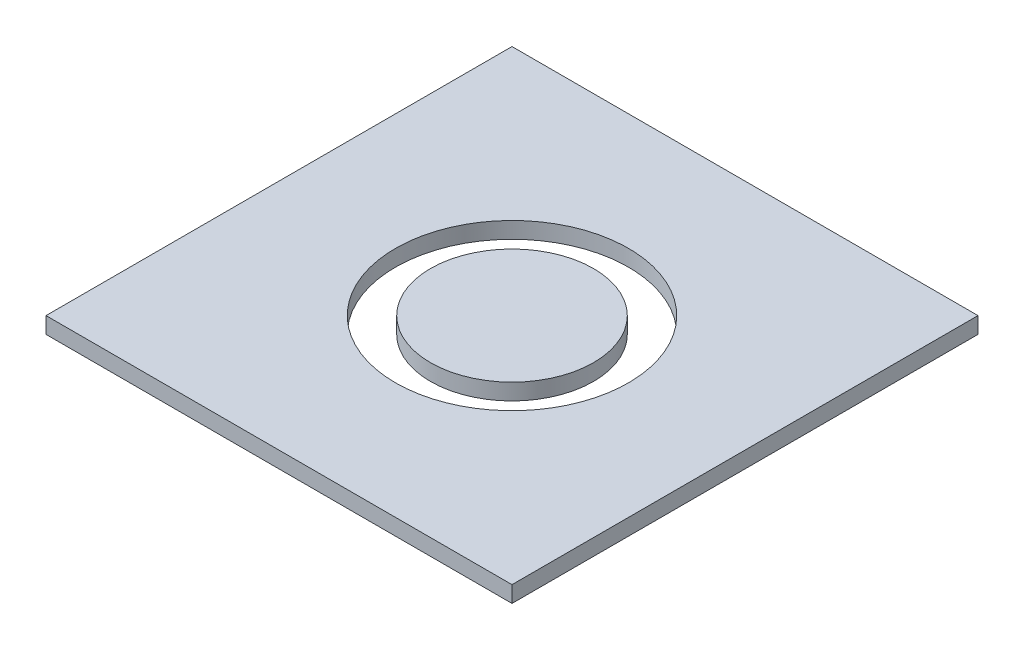
ISO-10303-21;
HEADER;
FILE_DESCRIPTION(('STEP AP214'),'2;1');
FILE_NAME('part.step','',(''),(''),'','','');
FILE_SCHEMA(('AUTOMOTIVE_DESIGN { 1 0 10303 214 1 1 1 1 }'));
ENDSEC;
DATA;
#1=APPLICATION_CONTEXT('core data for automotive mechanical design processes');
#2=APPLICATION_PROTOCOL_DEFINITION('international standard','automotive_design',2000,#1);
#3=PRODUCT_CONTEXT('',#1,'mechanical');
#4=PRODUCT('Part','Part','',(#3));
#5=PRODUCT_RELATED_PRODUCT_CATEGORY('part','',(#4));
#6=PRODUCT_DEFINITION_FORMATION('','',#4);
#7=PRODUCT_DEFINITION_CONTEXT('part definition',#1,'design');
#8=PRODUCT_DEFINITION('design','',#6,#7);
#9=PRODUCT_DEFINITION_SHAPE('','',#8);
#10=(LENGTH_UNIT() NAMED_UNIT(*) SI_UNIT(.MILLI.,.METRE.));
#11=(NAMED_UNIT(*) PLANE_ANGLE_UNIT() SI_UNIT($,.RADIAN.));
#12=(NAMED_UNIT(*) SI_UNIT($,.STERADIAN.) SOLID_ANGLE_UNIT());
#13=UNCERTAINTY_MEASURE_WITH_UNIT(LENGTH_MEASURE(1.E-05),#10,'distance_accuracy_value','');
#14=(GEOMETRIC_REPRESENTATION_CONTEXT(3) GLOBAL_UNCERTAINTY_ASSIGNED_CONTEXT((#13)) GLOBAL_UNIT_ASSIGNED_CONTEXT((#10,
#11,#12)) REPRESENTATION_CONTEXT('',''));
#15=CARTESIAN_POINT('',(0.,0.,0.));
#16=DIRECTION('',(0.,0.,1.));
#17=DIRECTION('',(1.,0.,0.));
#18=AXIS2_PLACEMENT_3D('',#15,#16,#17);
#19=CARTESIAN_POINT('',(0.,0.7,0.));
#20=DIRECTION('',(0.,-1.,0.));
#21=DIRECTION('',(0.,0.,-1.));
#22=AXIS2_PLACEMENT_3D('',#19,#20,#21);
#23=CYLINDRICAL_SURFACE('',#22,3.5);
#24=CARTESIAN_POINT('',(0.,0.7,0.));
#25=DIRECTION('',(0.,1.,0.));
#26=DIRECTION('',(0.,0.,1.));
#27=AXIS2_PLACEMENT_3D('',#24,#25,#26);
#28=CIRCLE('',#27,3.5);
#29=CARTESIAN_POINT('',(0.,0.7,3.5));
#30=VERTEX_POINT('',#29);
#31=EDGE_CURVE('E11',#30,#30,#28,.T.);
#32=ORIENTED_EDGE('',*,*,#31,.F.);
#33=EDGE_LOOP('',(#32));
#34=FACE_BOUND('',#33,.T.);
#35=CARTESIAN_POINT('',(0.,0.,0.));
#36=DIRECTION('',(0.,1.,0.));
#37=DIRECTION('',(0.,0.,1.));
#38=AXIS2_PLACEMENT_3D('',#35,#36,#37);
#39=CIRCLE('',#38,3.5);
#40=CARTESIAN_POINT('',(0.,0.,3.5));
#41=VERTEX_POINT('',#40);
#42=EDGE_CURVE('E44',#41,#41,#39,.T.);
#43=ORIENTED_EDGE('',*,*,#42,.T.);
#44=EDGE_LOOP('',(#43));
#45=FACE_BOUND('',#44,.T.);
#46=ADVANCED_FACE('F41',(#34,#45),#23,.T.);
#47=CARTESIAN_POINT('',(0.,0.7,0.));
#48=DIRECTION('',(0.,1.,0.));
#49=DIRECTION('',(0.,0.,1.));
#50=AXIS2_PLACEMENT_3D('',#47,#48,#49);
#51=PLANE('',#50);
#52=ORIENTED_EDGE('',*,*,#31,.T.);
#53=EDGE_LOOP('',(#52));
#54=FACE_BOUND('',#53,.T.);
#55=ADVANCED_FACE('F56',(#54),#51,.T.);
#56=CARTESIAN_POINT('',(0.,0.,0.));
#57=DIRECTION('',(0.,1.,0.));
#58=DIRECTION('',(0.,0.,1.));
#59=AXIS2_PLACEMENT_3D('',#56,#57,#58);
#60=PLANE('',#59);
#61=ORIENTED_EDGE('',*,*,#42,.F.);
#62=EDGE_LOOP('',(#61));
#63=FACE_BOUND('',#62,.T.);
#64=ADVANCED_FACE('F54',(#63),#60,.F.);
#65=CLOSED_SHELL('',(#46,#55,#64));
#66=MANIFOLD_SOLID_BREP('B2',#65);
#67=CARTESIAN_POINT('',(-10.,0.7,-10.));
#68=DIRECTION('',(0.,0.,-1.));
#69=DIRECTION('',(-1.,0.,0.));
#70=AXIS2_PLACEMENT_3D('',#67,#68,#69);
#71=PLANE('',#70);
#72=DIRECTION('',(1.,0.,0.));
#73=VECTOR('',#72,1.);
#74=CARTESIAN_POINT('',(-10.,0.,-10.));
#75=LINE('',#74,#73);
#76=CARTESIAN_POINT('',(-10.,0.,-10.));
#77=VERTEX_POINT('',#76);
#78=CARTESIAN_POINT('',(10.,0.,-10.));
#79=VERTEX_POINT('',#78);
#80=EDGE_CURVE('E148',#77,#79,#75,.T.);
#81=ORIENTED_EDGE('',*,*,#80,.F.);
#82=DIRECTION('',(0.,-1.,0.));
#83=VECTOR('',#82,1.);
#84=CARTESIAN_POINT('',(-10.,0.7,-10.));
#85=LINE('',#84,#83);
#86=CARTESIAN_POINT('',(-10.,0.7,-10.));
#87=VERTEX_POINT('',#86);
#88=EDGE_CURVE('E39',#87,#77,#85,.T.);
#89=ORIENTED_EDGE('',*,*,#88,.F.);
#90=DIRECTION('',(1.,0.,0.));
#91=VECTOR('',#90,1.);
#92=CARTESIAN_POINT('',(-10.,0.7,-10.));
#93=LINE('',#92,#91);
#94=CARTESIAN_POINT('',(10.,0.7,-10.));
#95=VERTEX_POINT('',#94);
#96=EDGE_CURVE('E142',#87,#95,#93,.T.);
#97=ORIENTED_EDGE('',*,*,#96,.T.);
#98=DIRECTION('',(0.,-1.,0.));
#99=VECTOR('',#98,1.);
#100=CARTESIAN_POINT('',(10.,0.7,-10.));
#101=LINE('',#100,#99);
#102=EDGE_CURVE('E85',#95,#79,#101,.T.);
#103=ORIENTED_EDGE('',*,*,#102,.T.);
#104=EDGE_LOOP('',(#81,#89,#97,#103));
#105=FACE_BOUND('',#104,.T.);
#106=ADVANCED_FACE('F82',(#105),#71,.T.);
#107=CARTESIAN_POINT('',(-10.,0.7,-10.));
#108=DIRECTION('',(1.,0.,0.));
#109=DIRECTION('',(0.,0.,-1.));
#110=AXIS2_PLACEMENT_3D('',#107,#108,#109);
#111=PLANE('',#110);
#112=DIRECTION('',(0.,0.,1.));
#113=VECTOR('',#112,1.);
#114=CARTESIAN_POINT('',(-10.,0.,-10.));
#115=LINE('',#114,#113);
#116=CARTESIAN_POINT('',(-10.,0.,10.));
#117=VERTEX_POINT('',#116);
#118=EDGE_CURVE('E115',#77,#117,#115,.T.);
#119=ORIENTED_EDGE('',*,*,#118,.T.);
#120=DIRECTION('',(0.,-1.,0.));
#121=VECTOR('',#120,1.);
#122=CARTESIAN_POINT('',(-10.,0.7,10.));
#123=LINE('',#122,#121);
#124=CARTESIAN_POINT('',(-10.,0.7,10.));
#125=VERTEX_POINT('',#124);
#126=EDGE_CURVE('E91',#125,#117,#123,.T.);
#127=ORIENTED_EDGE('',*,*,#126,.F.);
#128=DIRECTION('',(0.,0.,1.));
#129=VECTOR('',#128,1.);
#130=CARTESIAN_POINT('',(-10.,0.7,-10.));
#131=LINE('',#130,#129);
#132=EDGE_CURVE('E132',#87,#125,#131,.T.);
#133=ORIENTED_EDGE('',*,*,#132,.F.);
#134=ORIENTED_EDGE('',*,*,#88,.T.);
#135=EDGE_LOOP('',(#119,#127,#133,#134));
#136=FACE_BOUND('',#135,.T.);
#137=ADVANCED_FACE('F159',(#136),#111,.F.);
#138=CARTESIAN_POINT('',(-10.,0.7,10.));
#139=DIRECTION('',(0.,0.,-1.));
#140=DIRECTION('',(-1.,0.,0.));
#141=AXIS2_PLACEMENT_3D('',#138,#139,#140);
#142=PLANE('',#141);
#143=DIRECTION('',(1.,0.,0.));
#144=VECTOR('',#143,1.);
#145=CARTESIAN_POINT('',(-10.,0.,10.));
#146=LINE('',#145,#144);
#147=CARTESIAN_POINT('',(10.,0.,10.));
#148=VERTEX_POINT('',#147);
#149=EDGE_CURVE('E139',#117,#148,#146,.T.);
#150=ORIENTED_EDGE('',*,*,#149,.T.);
#151=DIRECTION('',(0.,-1.,0.));
#152=VECTOR('',#151,1.);
#153=CARTESIAN_POINT('',(10.,0.7,10.));
#154=LINE('',#153,#152);
#155=CARTESIAN_POINT('',(10.,0.7,10.));
#156=VERTEX_POINT('',#155);
#157=EDGE_CURVE('E136',#156,#148,#154,.T.);
#158=ORIENTED_EDGE('',*,*,#157,.F.);
#159=DIRECTION('',(1.,0.,0.));
#160=VECTOR('',#159,1.);
#161=CARTESIAN_POINT('',(-10.,0.7,10.));
#162=LINE('',#161,#160);
#163=EDGE_CURVE('E127',#125,#156,#162,.T.);
#164=ORIENTED_EDGE('',*,*,#163,.F.);
#165=ORIENTED_EDGE('',*,*,#126,.T.);
#166=EDGE_LOOP('',(#150,#158,#164,#165));
#167=FACE_BOUND('',#166,.T.);
#168=ADVANCED_FACE('F137',(#167),#142,.F.);
#169=CARTESIAN_POINT('',(10.,0.7,-10.));
#170=DIRECTION('',(1.,0.,0.));
#171=DIRECTION('',(0.,0.,-1.));
#172=AXIS2_PLACEMENT_3D('',#169,#170,#171);
#173=PLANE('',#172);
#174=DIRECTION('',(0.,0.,1.));
#175=VECTOR('',#174,1.);
#176=CARTESIAN_POINT('',(10.,0.,-10.));
#177=LINE('',#176,#175);
#178=EDGE_CURVE('E151',#79,#148,#177,.T.);
#179=ORIENTED_EDGE('',*,*,#178,.F.);
#180=ORIENTED_EDGE('',*,*,#102,.F.);
#181=DIRECTION('',(0.,0.,1.));
#182=VECTOR('',#181,1.);
#183=CARTESIAN_POINT('',(10.,0.7,-10.));
#184=LINE('',#183,#182);
#185=EDGE_CURVE('E131',#95,#156,#184,.T.);
#186=ORIENTED_EDGE('',*,*,#185,.T.);
#187=ORIENTED_EDGE('',*,*,#157,.T.);
#188=EDGE_LOOP('',(#179,#180,#186,#187));
#189=FACE_BOUND('',#188,.T.);
#190=ADVANCED_FACE('F141',(#189),#173,.T.);
#191=CARTESIAN_POINT('',(0.,0.7,0.));
#192=DIRECTION('',(0.,-1.,0.));
#193=DIRECTION('',(0.,0.,-1.));
#194=AXIS2_PLACEMENT_3D('',#191,#192,#193);
#195=PLANE('',#194);
#196=CARTESIAN_POINT('',(0.,0.7,0.));
#197=DIRECTION('',(0.,1.,0.));
#198=DIRECTION('',(0.,0.,1.));
#199=AXIS2_PLACEMENT_3D('',#196,#197,#198);
#200=CIRCLE('',#199,5.);
#201=CARTESIAN_POINT('',(0.,0.7,5.));
#202=VERTEX_POINT('',#201);
#203=EDGE_CURVE('E190',#202,#202,#200,.T.);
#204=ORIENTED_EDGE('',*,*,#203,.F.);
#205=EDGE_LOOP('',(#204));
#206=FACE_BOUND('',#205,.T.);
#207=ORIENTED_EDGE('',*,*,#96,.F.);
#208=ORIENTED_EDGE('',*,*,#132,.T.);
#209=ORIENTED_EDGE('',*,*,#163,.T.);
#210=ORIENTED_EDGE('',*,*,#185,.F.);
#211=EDGE_LOOP('',(#207,#208,#209,#210));
#212=FACE_BOUND('',#211,.T.);
#213=ADVANCED_FACE('F130',(#206,#212),#195,.F.);
#214=CARTESIAN_POINT('',(0.,0.,0.));
#215=DIRECTION('',(0.,-1.,0.));
#216=DIRECTION('',(0.,0.,-1.));
#217=AXIS2_PLACEMENT_3D('',#214,#215,#216);
#218=PLANE('',#217);
#219=CARTESIAN_POINT('',(0.,0.,0.));
#220=DIRECTION('',(0.,1.,0.));
#221=DIRECTION('',(0.,0.,1.));
#222=AXIS2_PLACEMENT_3D('',#219,#220,#221);
#223=CIRCLE('',#222,5.);
#224=CARTESIAN_POINT('',(0.,0.,5.));
#225=VERTEX_POINT('',#224);
#226=EDGE_CURVE('E152',#225,#225,#223,.T.);
#227=ORIENTED_EDGE('',*,*,#226,.T.);
#228=EDGE_LOOP('',(#227));
#229=FACE_BOUND('',#228,.T.);
#230=ORIENTED_EDGE('',*,*,#80,.T.);
#231=ORIENTED_EDGE('',*,*,#178,.T.);
#232=ORIENTED_EDGE('',*,*,#149,.F.);
#233=ORIENTED_EDGE('',*,*,#118,.F.);
#234=EDGE_LOOP('',(#230,#231,#232,#233));
#235=FACE_BOUND('',#234,.T.);
#236=ADVANCED_FACE('F157',(#229,#235),#218,.T.);
#237=CARTESIAN_POINT('',(0.,0.,0.));
#238=DIRECTION('',(0.,1.,0.));
#239=DIRECTION('',(0.,0.,1.));
#240=AXIS2_PLACEMENT_3D('',#237,#238,#239);
#241=CYLINDRICAL_SURFACE('',#240,5.);
#242=ORIENTED_EDGE('',*,*,#226,.F.);
#243=EDGE_LOOP('',(#242));
#244=FACE_BOUND('',#243,.T.);
#245=ORIENTED_EDGE('',*,*,#203,.T.);
#246=EDGE_LOOP('',(#245));
#247=FACE_BOUND('',#246,.T.);
#248=ADVANCED_FACE('F178',(#244,#247),#241,.F.);
#249=CLOSED_SHELL('',(#106,#137,#168,#190,#213,#236,#248));
#250=MANIFOLD_SOLID_BREP('B6',#249);
#251=ADVANCED_BREP_SHAPE_REPRESENTATION('',(#18,#66,#250),#14);
#252=SHAPE_DEFINITION_REPRESENTATION(#9,#251);
ENDSEC;
END-ISO-10303-21;
